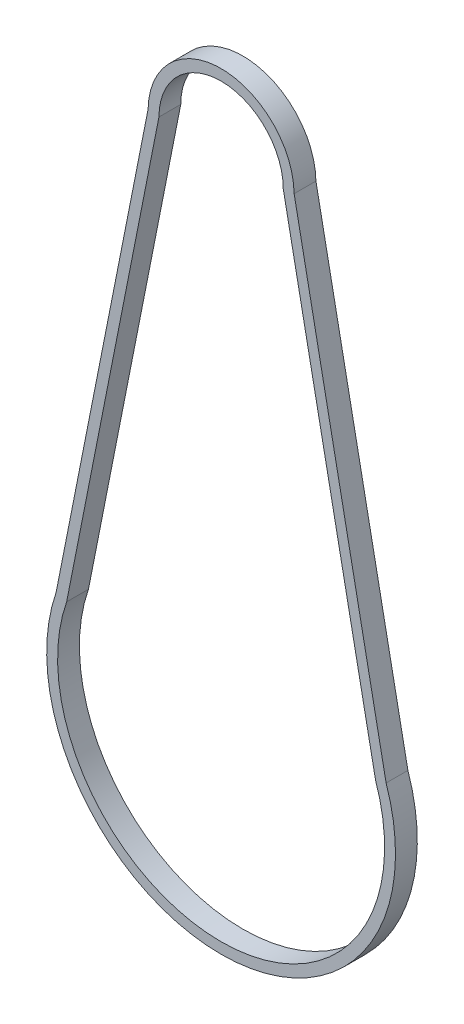
ISO-10303-21;
HEADER;
FILE_DESCRIPTION(('STEP AP214'),'2;1');
FILE_NAME('part.step','',(''),(''),'','','');
FILE_SCHEMA(('AUTOMOTIVE_DESIGN { 1 0 10303 214 1 1 1 1 }'));
ENDSEC;
DATA;
#1=APPLICATION_CONTEXT('core data for automotive mechanical design processes');
#2=APPLICATION_PROTOCOL_DEFINITION('international standard','automotive_design',2000,#1);
#3=PRODUCT_CONTEXT('',#1,'mechanical');
#4=PRODUCT('Part','Part','',(#3));
#5=PRODUCT_RELATED_PRODUCT_CATEGORY('part','',(#4));
#6=PRODUCT_DEFINITION_FORMATION('','',#4);
#7=PRODUCT_DEFINITION_CONTEXT('part definition',#1,'design');
#8=PRODUCT_DEFINITION('design','',#6,#7);
#9=PRODUCT_DEFINITION_SHAPE('','',#8);
#10=(LENGTH_UNIT() NAMED_UNIT(*) SI_UNIT(.MILLI.,.METRE.));
#11=(NAMED_UNIT(*) PLANE_ANGLE_UNIT() SI_UNIT($,.RADIAN.));
#12=(NAMED_UNIT(*) SI_UNIT($,.STERADIAN.) SOLID_ANGLE_UNIT());
#13=UNCERTAINTY_MEASURE_WITH_UNIT(LENGTH_MEASURE(1.E-05),#10,'distance_accuracy_value','');
#14=(GEOMETRIC_REPRESENTATION_CONTEXT(3) GLOBAL_UNCERTAINTY_ASSIGNED_CONTEXT((#13)) GLOBAL_UNIT_ASSIGNED_CONTEXT((#10,
#11,#12)) REPRESENTATION_CONTEXT('',''));
#15=CARTESIAN_POINT('',(0.,0.,0.));
#16=DIRECTION('',(0.,0.,1.));
#17=DIRECTION('',(1.,0.,0.));
#18=AXIS2_PLACEMENT_3D('',#15,#16,#17);
#19=CARTESIAN_POINT('',(0.,31.34,0.5));
#20=DIRECTION('',(0.,0.,1.));
#21=DIRECTION('',(1.,0.,0.));
#22=AXIS2_PLACEMENT_3D('',#19,#20,#21);
#23=PLANE('',#22);
#24=CARTESIAN_POINT('',(0.,31.34,0.5));
#25=DIRECTION('',(0.,0.,1.));
#26=DIRECTION('',(1.,0.,0.));
#27=AXIS2_PLACEMENT_3D('',#24,#25,#26);
#28=CIRCLE('',#27,3.35);
#29=CARTESIAN_POINT('',(3.34961169299876,31.391004961778,0.5));
#30=VERTEX_POINT('',#29);
#31=CARTESIAN_POINT('',(-3.34961169299876,31.391004961778,0.5));
#32=VERTEX_POINT('',#31);
#33=EDGE_CURVE('E138',#30,#32,#28,.T.);
#34=ORIENTED_EDGE('',*,*,#33,.T.);
#35=DIRECTION('',(-0.19430905993613,-0.980940359668587,0.));
#36=VECTOR('',#35,1.);
#37=CARTESIAN_POINT('',(-3.34961169299876,31.391004961778,0.5));
#38=LINE('',#37,#36);
#39=CARTESIAN_POINT('',(-7.56882996943399,10.0909096653102,0.5));
#40=VERTEX_POINT('',#39);
#41=EDGE_CURVE('E141',#32,#40,#38,.T.);
#42=ORIENTED_EDGE('',*,*,#41,.T.);
#43=CARTESIAN_POINT('',(0.,7.5,0.5));
#44=DIRECTION('',(0.,0.,1.));
#45=DIRECTION('',(1.,0.,0.));
#46=AXIS2_PLACEMENT_3D('',#43,#44,#45);
#47=CIRCLE('',#46,8.);
#48=CARTESIAN_POINT('',(7.568829969434,10.0909096653102,0.5));
#49=VERTEX_POINT('',#48);
#50=EDGE_CURVE('E144',#40,#49,#47,.T.);
#51=ORIENTED_EDGE('',*,*,#50,.T.);
#52=DIRECTION('',(-0.194309059936131,0.980940359668587,0.));
#53=VECTOR('',#52,1.);
#54=CARTESIAN_POINT('',(3.34961169299876,31.391004961778,0.5));
#55=LINE('',#54,#53);
#56=EDGE_CURVE('E146',#49,#30,#55,.T.);
#57=ORIENTED_EDGE('',*,*,#56,.T.);
#58=EDGE_LOOP('',(#34,#42,#51,#57));
#59=FACE_BOUND('',#58,.T.);
#60=DIRECTION('',(-0.19430905993613,-0.980940359668587,0.));
#61=VECTOR('',#60,1.);
#62=CARTESIAN_POINT('',(-2.85,31.34,0.5));
#63=LINE('',#62,#61);
#64=CARTESIAN_POINT('',(-2.85,31.34,0.5));
#65=VERTEX_POINT('',#64);
#66=CARTESIAN_POINT('',(-7.08499733103652,9.96024649561897,0.5));
#67=VERTEX_POINT('',#66);
#68=EDGE_CURVE('E110',#65,#67,#63,.T.);
#69=ORIENTED_EDGE('',*,*,#68,.F.);
#70=CARTESIAN_POINT('',(0.,31.34,0.5));
#71=DIRECTION('',(0.,0.,1.));
#72=DIRECTION('',(1.,0.,0.));
#73=AXIS2_PLACEMENT_3D('',#70,#71,#72);
#74=CIRCLE('',#73,2.85);
#75=CARTESIAN_POINT('',(2.85,31.34,0.5));
#76=VERTEX_POINT('',#75);
#77=EDGE_CURVE('E102',#76,#65,#74,.T.);
#78=ORIENTED_EDGE('',*,*,#77,.F.);
#79=DIRECTION('',(-0.194309059936131,0.980940359668587,0.));
#80=VECTOR('',#79,1.);
#81=CARTESIAN_POINT('',(2.85,31.34,0.5));
#82=LINE('',#81,#80);
#83=CARTESIAN_POINT('',(7.08499733103652,9.96024649561897,0.5));
#84=VERTEX_POINT('',#83);
#85=EDGE_CURVE('E124',#84,#76,#82,.T.);
#86=ORIENTED_EDGE('',*,*,#85,.F.);
#87=CARTESIAN_POINT('',(0.,7.5,0.5));
#88=DIRECTION('',(0.,0.,1.));
#89=DIRECTION('',(1.,0.,0.));
#90=AXIS2_PLACEMENT_3D('',#87,#88,#89);
#91=CIRCLE('',#90,7.5);
#92=EDGE_CURVE('E122',#67,#84,#91,.T.);
#93=ORIENTED_EDGE('',*,*,#92,.F.);
#94=EDGE_LOOP('',(#69,#78,#86,#93));
#95=FACE_BOUND('',#94,.T.);
#96=ADVANCED_FACE('F37',(#59,#95),#23,.T.);
#97=CARTESIAN_POINT('',(0.,31.34,-0.5));
#98=DIRECTION('',(0.,0.,1.));
#99=DIRECTION('',(1.,0.,0.));
#100=AXIS2_PLACEMENT_3D('',#97,#98,#99);
#101=PLANE('',#100);
#102=CARTESIAN_POINT('',(0.,31.34,-0.5));
#103=DIRECTION('',(0.,0.,1.));
#104=DIRECTION('',(1.,0.,0.));
#105=AXIS2_PLACEMENT_3D('',#102,#103,#104);
#106=CIRCLE('',#105,3.35);
#107=CARTESIAN_POINT('',(3.34961169299876,31.391004961778,-0.5));
#108=VERTEX_POINT('',#107);
#109=CARTESIAN_POINT('',(-3.34961169299876,31.391004961778,-0.5));
#110=VERTEX_POINT('',#109);
#111=EDGE_CURVE('E118',#108,#110,#106,.T.);
#112=ORIENTED_EDGE('',*,*,#111,.F.);
#113=DIRECTION('',(-0.194309059936131,0.980940359668587,0.));
#114=VECTOR('',#113,1.);
#115=CARTESIAN_POINT('',(3.34961169299876,31.391004961778,-0.5));
#116=LINE('',#115,#114);
#117=CARTESIAN_POINT('',(7.568829969434,10.0909096653102,-0.5));
#118=VERTEX_POINT('',#117);
#119=EDGE_CURVE('E142',#118,#108,#116,.T.);
#120=ORIENTED_EDGE('',*,*,#119,.F.);
#121=CARTESIAN_POINT('',(0.,7.5,-0.5));
#122=DIRECTION('',(0.,0.,1.));
#123=DIRECTION('',(1.,0.,0.));
#124=AXIS2_PLACEMENT_3D('',#121,#122,#123);
#125=CIRCLE('',#124,8.);
#126=CARTESIAN_POINT('',(-7.56882996943399,10.0909096653102,-0.5));
#127=VERTEX_POINT('',#126);
#128=EDGE_CURVE('E153',#127,#118,#125,.T.);
#129=ORIENTED_EDGE('',*,*,#128,.F.);
#130=DIRECTION('',(-0.19430905993613,-0.980940359668587,0.));
#131=VECTOR('',#130,1.);
#132=CARTESIAN_POINT('',(-3.34961169299876,31.391004961778,-0.5));
#133=LINE('',#132,#131);
#134=EDGE_CURVE('E151',#110,#127,#133,.T.);
#135=ORIENTED_EDGE('',*,*,#134,.F.);
#136=EDGE_LOOP('',(#112,#120,#129,#135));
#137=FACE_BOUND('',#136,.T.);
#138=CARTESIAN_POINT('',(0.,31.34,-0.5));
#139=DIRECTION('',(0.,0.,1.));
#140=DIRECTION('',(1.,0.,0.));
#141=AXIS2_PLACEMENT_3D('',#138,#139,#140);
#142=CIRCLE('',#141,2.85);
#143=CARTESIAN_POINT('',(2.85,31.34,-0.5));
#144=VERTEX_POINT('',#143);
#145=CARTESIAN_POINT('',(-2.85,31.34,-0.5));
#146=VERTEX_POINT('',#145);
#147=EDGE_CURVE('E60',#144,#146,#142,.T.);
#148=ORIENTED_EDGE('',*,*,#147,.T.);
#149=DIRECTION('',(-0.19430905993613,-0.980940359668587,0.));
#150=VECTOR('',#149,1.);
#151=CARTESIAN_POINT('',(-2.85,31.34,-0.5));
#152=LINE('',#151,#150);
#153=CARTESIAN_POINT('',(-7.08499733103652,9.96024649561897,-0.5));
#154=VERTEX_POINT('',#153);
#155=EDGE_CURVE('E117',#146,#154,#152,.T.);
#156=ORIENTED_EDGE('',*,*,#155,.T.);
#157=CARTESIAN_POINT('',(0.,7.5,-0.5));
#158=DIRECTION('',(0.,0.,1.));
#159=DIRECTION('',(1.,0.,0.));
#160=AXIS2_PLACEMENT_3D('',#157,#158,#159);
#161=CIRCLE('',#160,7.5);
#162=CARTESIAN_POINT('',(7.08499733103652,9.96024649561897,-0.5));
#163=VERTEX_POINT('',#162);
#164=EDGE_CURVE('E130',#154,#163,#161,.T.);
#165=ORIENTED_EDGE('',*,*,#164,.T.);
#166=DIRECTION('',(-0.194309059936131,0.980940359668587,0.));
#167=VECTOR('',#166,1.);
#168=CARTESIAN_POINT('',(2.85,31.34,-0.5));
#169=LINE('',#168,#167);
#170=EDGE_CURVE('E111',#163,#144,#169,.T.);
#171=ORIENTED_EDGE('',*,*,#170,.T.);
#172=EDGE_LOOP('',(#148,#156,#165,#171));
#173=FACE_BOUND('',#172,.T.);
#174=ADVANCED_FACE('F171',(#137,#173),#101,.F.);
#175=CARTESIAN_POINT('',(0.,31.34,0.5));
#176=DIRECTION('',(0.,0.,-1.));
#177=DIRECTION('',(-1.,0.,0.));
#178=AXIS2_PLACEMENT_3D('',#175,#176,#177);
#179=CYLINDRICAL_SURFACE('',#178,3.35);
#180=ORIENTED_EDGE('',*,*,#111,.T.);
#181=DIRECTION('',(0.,0.,-1.));
#182=VECTOR('',#181,1.);
#183=CARTESIAN_POINT('',(-3.34961169299876,31.391004961778,0.5));
#184=LINE('',#183,#182);
#185=EDGE_CURVE('E11',#32,#110,#184,.T.);
#186=ORIENTED_EDGE('',*,*,#185,.F.);
#187=ORIENTED_EDGE('',*,*,#33,.F.);
#188=DIRECTION('',(0.,0.,-1.));
#189=VECTOR('',#188,1.);
#190=CARTESIAN_POINT('',(3.34961169299876,31.391004961778,0.5));
#191=LINE('',#190,#189);
#192=EDGE_CURVE('E148',#30,#108,#191,.T.);
#193=ORIENTED_EDGE('',*,*,#192,.T.);
#194=EDGE_LOOP('',(#180,#186,#187,#193));
#195=FACE_BOUND('',#194,.T.);
#196=ADVANCED_FACE('F39',(#195),#179,.T.);
#197=CARTESIAN_POINT('',(-3.34961169299876,31.391004961778,0.5));
#198=DIRECTION('',(0.980940359668587,-0.19430905993613,0.));
#199=DIRECTION('',(0.19430905993613,0.980940359668587,0.));
#200=AXIS2_PLACEMENT_3D('',#197,#198,#199);
#201=PLANE('',#200);
#202=ORIENTED_EDGE('',*,*,#134,.T.);
#203=DIRECTION('',(0.,0.,-1.));
#204=VECTOR('',#203,1.);
#205=CARTESIAN_POINT('',(-7.56882996943399,10.0909096653102,0.5));
#206=LINE('',#205,#204);
#207=EDGE_CURVE('E45',#40,#127,#206,.T.);
#208=ORIENTED_EDGE('',*,*,#207,.F.);
#209=ORIENTED_EDGE('',*,*,#41,.F.);
#210=ORIENTED_EDGE('',*,*,#185,.T.);
#211=EDGE_LOOP('',(#202,#208,#209,#210));
#212=FACE_BOUND('',#211,.T.);
#213=ADVANCED_FACE('F181',(#212),#201,.F.);
#214=CARTESIAN_POINT('',(0.,7.5,0.5));
#215=DIRECTION('',(0.,0.,-1.));
#216=DIRECTION('',(-1.,0.,0.));
#217=AXIS2_PLACEMENT_3D('',#214,#215,#216);
#218=CYLINDRICAL_SURFACE('',#217,8.);
#219=ORIENTED_EDGE('',*,*,#128,.T.);
#220=DIRECTION('',(0.,0.,-1.));
#221=VECTOR('',#220,1.);
#222=CARTESIAN_POINT('',(7.568829969434,10.0909096653102,0.5));
#223=LINE('',#222,#221);
#224=EDGE_CURVE('E158',#49,#118,#223,.T.);
#225=ORIENTED_EDGE('',*,*,#224,.F.);
#226=ORIENTED_EDGE('',*,*,#50,.F.);
#227=ORIENTED_EDGE('',*,*,#207,.T.);
#228=EDGE_LOOP('',(#219,#225,#226,#227));
#229=FACE_BOUND('',#228,.T.);
#230=ADVANCED_FACE('F165',(#229),#218,.T.);
#231=CARTESIAN_POINT('',(3.34961169299876,31.391004961778,0.5));
#232=DIRECTION('',(-0.980940359668587,-0.194309059936131,0.));
#233=DIRECTION('',(0.194309059936131,-0.980940359668587,0.));
#234=AXIS2_PLACEMENT_3D('',#231,#232,#233);
#235=PLANE('',#234);
#236=ORIENTED_EDGE('',*,*,#119,.T.);
#237=ORIENTED_EDGE('',*,*,#192,.F.);
#238=ORIENTED_EDGE('',*,*,#56,.F.);
#239=ORIENTED_EDGE('',*,*,#224,.T.);
#240=EDGE_LOOP('',(#236,#237,#238,#239));
#241=FACE_BOUND('',#240,.T.);
#242=ADVANCED_FACE('F175',(#241),#235,.F.);
#243=CARTESIAN_POINT('',(0.,31.34,0.5));
#244=DIRECTION('',(0.,0.,-1.));
#245=DIRECTION('',(-1.,0.,0.));
#246=AXIS2_PLACEMENT_3D('',#243,#244,#245);
#247=CYLINDRICAL_SURFACE('',#246,2.85);
#248=ORIENTED_EDGE('',*,*,#147,.F.);
#249=DIRECTION('',(0.,0.,-1.));
#250=VECTOR('',#249,1.);
#251=CARTESIAN_POINT('',(2.85,31.34,0.5));
#252=LINE('',#251,#250);
#253=EDGE_CURVE('E106',#76,#144,#252,.T.);
#254=ORIENTED_EDGE('',*,*,#253,.F.);
#255=ORIENTED_EDGE('',*,*,#77,.T.);
#256=DIRECTION('',(0.,0.,-1.));
#257=VECTOR('',#256,1.);
#258=CARTESIAN_POINT('',(-2.85,31.34,0.5));
#259=LINE('',#258,#257);
#260=EDGE_CURVE('E105',#65,#146,#259,.T.);
#261=ORIENTED_EDGE('',*,*,#260,.T.);
#262=EDGE_LOOP('',(#248,#254,#255,#261));
#263=FACE_BOUND('',#262,.T.);
#264=ADVANCED_FACE('F104',(#263),#247,.F.);
#265=CARTESIAN_POINT('',(-2.85,31.34,0.5));
#266=DIRECTION('',(0.980940359668587,-0.19430905993613,0.));
#267=DIRECTION('',(0.19430905993613,0.980940359668587,0.));
#268=AXIS2_PLACEMENT_3D('',#265,#266,#267);
#269=PLANE('',#268);
#270=ORIENTED_EDGE('',*,*,#155,.F.);
#271=ORIENTED_EDGE('',*,*,#260,.F.);
#272=ORIENTED_EDGE('',*,*,#68,.T.);
#273=DIRECTION('',(0.,0.,-1.));
#274=VECTOR('',#273,1.);
#275=CARTESIAN_POINT('',(-7.08499733103652,9.96024649561897,0.5));
#276=LINE('',#275,#274);
#277=EDGE_CURVE('E119',#67,#154,#276,.T.);
#278=ORIENTED_EDGE('',*,*,#277,.T.);
#279=EDGE_LOOP('',(#270,#271,#272,#278));
#280=FACE_BOUND('',#279,.T.);
#281=ADVANCED_FACE('F114',(#280),#269,.T.);
#282=CARTESIAN_POINT('',(0.,7.5,0.5));
#283=DIRECTION('',(0.,0.,-1.));
#284=DIRECTION('',(-1.,0.,0.));
#285=AXIS2_PLACEMENT_3D('',#282,#283,#284);
#286=CYLINDRICAL_SURFACE('',#285,7.5);
#287=ORIENTED_EDGE('',*,*,#164,.F.);
#288=ORIENTED_EDGE('',*,*,#277,.F.);
#289=ORIENTED_EDGE('',*,*,#92,.T.);
#290=DIRECTION('',(0.,0.,-1.));
#291=VECTOR('',#290,1.);
#292=CARTESIAN_POINT('',(7.08499733103652,9.96024649561897,0.5));
#293=LINE('',#292,#291);
#294=EDGE_CURVE('E52',#84,#163,#293,.T.);
#295=ORIENTED_EDGE('',*,*,#294,.T.);
#296=EDGE_LOOP('',(#287,#288,#289,#295));
#297=FACE_BOUND('',#296,.T.);
#298=ADVANCED_FACE('F204',(#297),#286,.F.);
#299=CARTESIAN_POINT('',(2.85,31.34,0.5));
#300=DIRECTION('',(-0.980940359668587,-0.194309059936131,0.));
#301=DIRECTION('',(0.194309059936131,-0.980940359668587,0.));
#302=AXIS2_PLACEMENT_3D('',#299,#300,#301);
#303=PLANE('',#302);
#304=ORIENTED_EDGE('',*,*,#170,.F.);
#305=ORIENTED_EDGE('',*,*,#294,.F.);
#306=ORIENTED_EDGE('',*,*,#85,.T.);
#307=ORIENTED_EDGE('',*,*,#253,.T.);
#308=EDGE_LOOP('',(#304,#305,#306,#307));
#309=FACE_BOUND('',#308,.T.);
#310=ADVANCED_FACE('F208',(#309),#303,.T.);
#311=CLOSED_SHELL('',(#96,#174,#196,#213,#230,#242,#264,#281,#298,#310));
#312=MANIFOLD_SOLID_BREP('B2',#311);
#313=ADVANCED_BREP_SHAPE_REPRESENTATION('',(#18,#312),#14);
#314=SHAPE_DEFINITION_REPRESENTATION(#9,#313);
ENDSEC;
END-ISO-10303-21;
